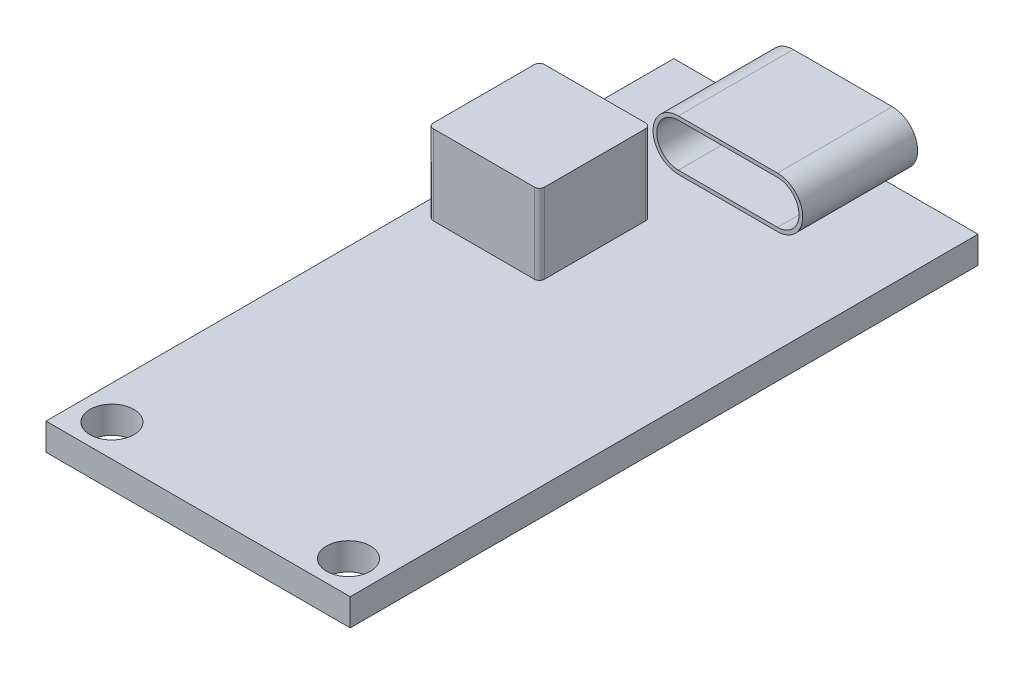
ISO-10303-21;
HEADER;
FILE_DESCRIPTION(('STEP AP214'),'2;1');
FILE_NAME('part.step','',(''),(''),'','','');
FILE_SCHEMA(('AUTOMOTIVE_DESIGN { 1 0 10303 214 1 1 1 1 }'));
ENDSEC;
DATA;
#1=APPLICATION_CONTEXT('core data for automotive mechanical design processes');
#2=APPLICATION_PROTOCOL_DEFINITION('international standard','automotive_design',2000,#1);
#3=PRODUCT_CONTEXT('',#1,'mechanical');
#4=PRODUCT('Part','Part','',(#3));
#5=PRODUCT_RELATED_PRODUCT_CATEGORY('part','',(#4));
#6=PRODUCT_DEFINITION_FORMATION('','',#4);
#7=PRODUCT_DEFINITION_CONTEXT('part definition',#1,'design');
#8=PRODUCT_DEFINITION('design','',#6,#7);
#9=PRODUCT_DEFINITION_SHAPE('','',#8);
#10=(LENGTH_UNIT() NAMED_UNIT(*) SI_UNIT(.MILLI.,.METRE.));
#11=(NAMED_UNIT(*) PLANE_ANGLE_UNIT() SI_UNIT($,.RADIAN.));
#12=(NAMED_UNIT(*) SI_UNIT($,.STERADIAN.) SOLID_ANGLE_UNIT());
#13=UNCERTAINTY_MEASURE_WITH_UNIT(LENGTH_MEASURE(1.E-05),#10,'distance_accuracy_value','');
#14=(GEOMETRIC_REPRESENTATION_CONTEXT(3) GLOBAL_UNCERTAINTY_ASSIGNED_CONTEXT((#13)) GLOBAL_UNIT_ASSIGNED_CONTEXT((#10,
#11,#12)) REPRESENTATION_CONTEXT('',''));
#15=CARTESIAN_POINT('',(0.,0.,0.));
#16=DIRECTION('',(0.,0.,1.));
#17=DIRECTION('',(1.,0.,0.));
#18=AXIS2_PLACEMENT_3D('',#15,#16,#17);
#19=CARTESIAN_POINT('',(0.,1.6,0.));
#20=DIRECTION('',(0.,1.,0.));
#21=DIRECTION('',(0.,0.,1.));
#22=AXIS2_PLACEMENT_3D('',#19,#20,#21);
#23=PLANE('',#22);
#24=CARTESIAN_POINT('',(-7.,1.6,16.675));
#25=DIRECTION('',(0.,1.,0.));
#26=DIRECTION('',(0.,0.,1.));
#27=AXIS2_PLACEMENT_3D('',#24,#25,#26);
#28=CIRCLE('',#27,1.3);
#29=CARTESIAN_POINT('',(-7.,1.6,17.975));
#30=VERTEX_POINT('',#29);
#31=EDGE_CURVE('E274',#30,#30,#28,.T.);
#32=ORIENTED_EDGE('',*,*,#31,.F.);
#33=EDGE_LOOP('',(#32));
#34=FACE_BOUND('',#33,.T.);
#35=CARTESIAN_POINT('',(7.,1.6,16.675));
#36=DIRECTION('',(0.,1.,0.));
#37=DIRECTION('',(0.,0.,1.));
#38=AXIS2_PLACEMENT_3D('',#35,#36,#37);
#39=CIRCLE('',#38,1.3);
#40=CARTESIAN_POINT('',(7.,1.6,17.975));
#41=VERTEX_POINT('',#40);
#42=EDGE_CURVE('E277',#41,#41,#39,.T.);
#43=ORIENTED_EDGE('',*,*,#42,.F.);
#44=EDGE_LOOP('',(#43));
#45=FACE_BOUND('',#44,.T.);
#46=DIRECTION('',(-1.,0.,0.));
#47=VECTOR('',#46,1.);
#48=CARTESIAN_POINT('',(-2.93,1.6,-12.775));
#49=LINE('',#48,#47);
#50=CARTESIAN_POINT('',(2.93,1.6,-12.775));
#51=VERTEX_POINT('',#50);
#52=CARTESIAN_POINT('',(-2.93,1.6,-12.775));
#53=VERTEX_POINT('',#52);
#54=EDGE_CURVE('E254',#51,#53,#49,.T.);
#55=ORIENTED_EDGE('',*,*,#54,.T.);
#56=DIRECTION('',(0.,0.,-1.));
#57=VECTOR('',#56,1.);
#58=CARTESIAN_POINT('',(-2.93,1.6,-12.775));
#59=LINE('',#58,#57);
#60=CARTESIAN_POINT('',(-2.93,1.6,-18.575));
#61=VERTEX_POINT('',#60);
#62=EDGE_CURVE('E258',#53,#61,#59,.T.);
#63=ORIENTED_EDGE('',*,*,#62,.T.);
#64=DIRECTION('',(-1.,0.,0.));
#65=VECTOR('',#64,1.);
#66=CARTESIAN_POINT('',(9.,1.6,-18.575));
#67=LINE('',#66,#65);
#68=CARTESIAN_POINT('',(-9.,1.6,-18.575));
#69=VERTEX_POINT('',#68);
#70=EDGE_CURVE('E290',#61,#69,#67,.T.);
#71=ORIENTED_EDGE('',*,*,#70,.T.);
#72=DIRECTION('',(0.,0.,1.));
#73=VECTOR('',#72,1.);
#74=CARTESIAN_POINT('',(-9.,1.6,18.575));
#75=LINE('',#74,#73);
#76=CARTESIAN_POINT('',(-9.,1.6,18.575));
#77=VERTEX_POINT('',#76);
#78=EDGE_CURVE('E282',#69,#77,#75,.T.);
#79=ORIENTED_EDGE('',*,*,#78,.T.);
#80=DIRECTION('',(1.,0.,0.));
#81=VECTOR('',#80,1.);
#82=CARTESIAN_POINT('',(9.,1.6,18.575));
#83=LINE('',#82,#81);
#84=CARTESIAN_POINT('',(9.,1.6,18.575));
#85=VERTEX_POINT('',#84);
#86=EDGE_CURVE('E285',#77,#85,#83,.T.);
#87=ORIENTED_EDGE('',*,*,#86,.T.);
#88=DIRECTION('',(0.,0.,-1.));
#89=VECTOR('',#88,1.);
#90=CARTESIAN_POINT('',(9.,1.6,18.575));
#91=LINE('',#90,#89);
#92=CARTESIAN_POINT('',(9.,1.6,-18.575));
#93=VERTEX_POINT('',#92);
#94=EDGE_CURVE('E288',#85,#93,#91,.T.);
#95=ORIENTED_EDGE('',*,*,#94,.T.);
#96=CARTESIAN_POINT('',(2.93,1.6,-18.575));
#97=VERTEX_POINT('',#96);
#98=EDGE_CURVE('E291',#93,#97,#67,.T.);
#99=ORIENTED_EDGE('',*,*,#98,.T.);
#100=DIRECTION('',(0.,0.,-1.));
#101=VECTOR('',#100,1.);
#102=CARTESIAN_POINT('',(2.93,1.6,-12.775));
#103=LINE('',#102,#101);
#104=EDGE_CURVE('E263',#51,#97,#103,.T.);
#105=ORIENTED_EDGE('',*,*,#104,.F.);
#106=EDGE_LOOP('',(#55,#63,#71,#79,#87,#95,#99,#105));
#107=FACE_BOUND('',#106,.T.);
#108=DIRECTION('',(-1.,0.,0.));
#109=VECTOR('',#108,1.);
#110=CARTESIAN_POINT('',(-8.1,1.6,-9.72500000000001));
#111=LINE('',#110,#109);
#112=CARTESIAN_POINT('',(-1.82,1.6,-9.72500000000001));
#113=VERTEX_POINT('',#112);
#114=CARTESIAN_POINT('',(-7.8,1.6,-9.72500000000001));
#115=VERTEX_POINT('',#114);
#116=EDGE_CURVE('E354',#113,#115,#111,.T.);
#117=ORIENTED_EDGE('',*,*,#116,.F.);
#118=CARTESIAN_POINT('',(-1.82,1.6,-9.42500000000001));
#119=DIRECTION('',(0.,1.,0.));
#120=DIRECTION('',(0.,0.,1.));
#121=AXIS2_PLACEMENT_3D('',#118,#119,#120);
#122=CIRCLE('',#121,0.3);
#123=CARTESIAN_POINT('',(-1.52,1.6,-9.42500000000001));
#124=VERTEX_POINT('',#123);
#125=EDGE_CURVE('E343',#113,#124,#122,.F.);
#126=ORIENTED_EDGE('',*,*,#125,.T.);
#127=DIRECTION('',(0.,0.,-1.));
#128=VECTOR('',#127,1.);
#129=CARTESIAN_POINT('',(-1.52,1.6,-9.72500000000001));
#130=LINE('',#129,#128);
#131=CARTESIAN_POINT('',(-1.52,1.6,-3.44500000000001));
#132=VERTEX_POINT('',#131);
#133=EDGE_CURVE('E373',#132,#124,#130,.T.);
#134=ORIENTED_EDGE('',*,*,#133,.F.);
#135=CARTESIAN_POINT('',(-1.82,1.6,-3.44500000000001));
#136=DIRECTION('',(0.,1.,0.));
#137=DIRECTION('',(0.,0.,1.));
#138=AXIS2_PLACEMENT_3D('',#135,#136,#137);
#139=CIRCLE('',#138,0.3);
#140=CARTESIAN_POINT('',(-1.82,1.6,-3.14500000000001));
#141=VERTEX_POINT('',#140);
#142=EDGE_CURVE('E11',#132,#141,#139,.F.);
#143=ORIENTED_EDGE('',*,*,#142,.T.);
#144=DIRECTION('',(1.,0.,0.));
#145=VECTOR('',#144,1.);
#146=CARTESIAN_POINT('',(-8.1,1.6,-3.14500000000001));
#147=LINE('',#146,#145);
#148=CARTESIAN_POINT('',(-7.8,1.6,-3.14500000000001));
#149=VERTEX_POINT('',#148);
#150=EDGE_CURVE('E348',#149,#141,#147,.T.);
#151=ORIENTED_EDGE('',*,*,#150,.F.);
#152=CARTESIAN_POINT('',(-7.8,1.6,-3.44500000000001));
#153=DIRECTION('',(0.,1.,0.));
#154=DIRECTION('',(0.,0.,1.));
#155=AXIS2_PLACEMENT_3D('',#152,#153,#154);
#156=CIRCLE('',#155,0.3);
#157=CARTESIAN_POINT('',(-8.1,1.6,-3.44500000000001));
#158=VERTEX_POINT('',#157);
#159=EDGE_CURVE('E55',#149,#158,#156,.F.);
#160=ORIENTED_EDGE('',*,*,#159,.T.);
#161=DIRECTION('',(0.,0.,1.));
#162=VECTOR('',#161,1.);
#163=CARTESIAN_POINT('',(-8.1,1.6,-9.72500000000001));
#164=LINE('',#163,#162);
#165=CARTESIAN_POINT('',(-8.1,1.6,-9.42500000000001));
#166=VERTEX_POINT('',#165);
#167=EDGE_CURVE('E347',#166,#158,#164,.T.);
#168=ORIENTED_EDGE('',*,*,#167,.F.);
#169=CARTESIAN_POINT('',(-7.8,1.6,-9.42500000000001));
#170=DIRECTION('',(0.,1.,0.));
#171=DIRECTION('',(0.,0.,1.));
#172=AXIS2_PLACEMENT_3D('',#169,#170,#171);
#173=CIRCLE('',#172,0.3);
#174=EDGE_CURVE('E341',#166,#115,#173,.F.);
#175=ORIENTED_EDGE('',*,*,#174,.T.);
#176=EDGE_LOOP('',(#117,#126,#134,#143,#151,#160,#168,#175));
#177=FACE_BOUND('',#176,.T.);
#178=ADVANCED_FACE('F47',(#34,#45,#107,#177),#23,.T.);
#179=CARTESIAN_POINT('',(-9.,1.6,18.575));
#180=DIRECTION('',(1.,0.,0.));
#181=DIRECTION('',(0.,0.,-1.));
#182=AXIS2_PLACEMENT_3D('',#179,#180,#181);
#183=PLANE('',#182);
#184=DIRECTION('',(0.,0.,1.));
#185=VECTOR('',#184,1.);
#186=CARTESIAN_POINT('',(-9.,0.,18.575));
#187=LINE('',#186,#185);
#188=CARTESIAN_POINT('',(-9.,0.,-18.575));
#189=VERTEX_POINT('',#188);
#190=CARTESIAN_POINT('',(-9.,0.,18.575));
#191=VERTEX_POINT('',#190);
#192=EDGE_CURVE('E273',#189,#191,#187,.T.);
#193=ORIENTED_EDGE('',*,*,#192,.T.);
#194=DIRECTION('',(0.,-1.,0.));
#195=VECTOR('',#194,1.);
#196=CARTESIAN_POINT('',(-9.,1.6,18.575));
#197=LINE('',#196,#195);
#198=EDGE_CURVE('E311',#77,#191,#197,.T.);
#199=ORIENTED_EDGE('',*,*,#198,.F.);
#200=ORIENTED_EDGE('',*,*,#78,.F.);
#201=DIRECTION('',(0.,-1.,0.));
#202=VECTOR('',#201,1.);
#203=CARTESIAN_POINT('',(-9.,1.6,-18.575));
#204=LINE('',#203,#202);
#205=EDGE_CURVE('E294',#69,#189,#204,.T.);
#206=ORIENTED_EDGE('',*,*,#205,.T.);
#207=EDGE_LOOP('',(#193,#199,#200,#206));
#208=FACE_BOUND('',#207,.T.);
#209=ADVANCED_FACE('F402',(#208),#183,.F.);
#210=CARTESIAN_POINT('',(9.,1.6,18.575));
#211=DIRECTION('',(0.,0.,-1.));
#212=DIRECTION('',(-1.,0.,0.));
#213=AXIS2_PLACEMENT_3D('',#210,#211,#212);
#214=PLANE('',#213);
#215=DIRECTION('',(1.,0.,0.));
#216=VECTOR('',#215,1.);
#217=CARTESIAN_POINT('',(9.,0.,18.575));
#218=LINE('',#217,#216);
#219=CARTESIAN_POINT('',(9.,0.,18.575));
#220=VERTEX_POINT('',#219);
#221=EDGE_CURVE('E298',#191,#220,#218,.T.);
#222=ORIENTED_EDGE('',*,*,#221,.T.);
#223=DIRECTION('',(0.,-1.,0.));
#224=VECTOR('',#223,1.);
#225=CARTESIAN_POINT('',(9.,1.6,18.575));
#226=LINE('',#225,#224);
#227=EDGE_CURVE('E308',#85,#220,#226,.T.);
#228=ORIENTED_EDGE('',*,*,#227,.F.);
#229=ORIENTED_EDGE('',*,*,#86,.F.);
#230=ORIENTED_EDGE('',*,*,#198,.T.);
#231=EDGE_LOOP('',(#222,#228,#229,#230));
#232=FACE_BOUND('',#231,.T.);
#233=ADVANCED_FACE('F408',(#232),#214,.F.);
#234=CARTESIAN_POINT('',(9.,1.6,18.575));
#235=DIRECTION('',(-1.,0.,0.));
#236=DIRECTION('',(0.,0.,1.));
#237=AXIS2_PLACEMENT_3D('',#234,#235,#236);
#238=PLANE('',#237);
#239=DIRECTION('',(0.,0.,-1.));
#240=VECTOR('',#239,1.);
#241=CARTESIAN_POINT('',(9.,0.,18.575));
#242=LINE('',#241,#240);
#243=CARTESIAN_POINT('',(9.,0.,-18.575));
#244=VERTEX_POINT('',#243);
#245=EDGE_CURVE('E300',#220,#244,#242,.T.);
#246=ORIENTED_EDGE('',*,*,#245,.T.);
#247=DIRECTION('',(0.,-1.,0.));
#248=VECTOR('',#247,1.);
#249=CARTESIAN_POINT('',(9.,1.6,-18.575));
#250=LINE('',#249,#248);
#251=EDGE_CURVE('E305',#93,#244,#250,.T.);
#252=ORIENTED_EDGE('',*,*,#251,.F.);
#253=ORIENTED_EDGE('',*,*,#94,.F.);
#254=ORIENTED_EDGE('',*,*,#227,.T.);
#255=EDGE_LOOP('',(#246,#252,#253,#254));
#256=FACE_BOUND('',#255,.T.);
#257=ADVANCED_FACE('F424',(#256),#238,.F.);
#258=CARTESIAN_POINT('',(9.,1.6,-18.575));
#259=DIRECTION('',(0.,0.,1.));
#260=DIRECTION('',(1.,0.,0.));
#261=AXIS2_PLACEMENT_3D('',#258,#259,#260);
#262=PLANE('',#261);
#263=DIRECTION('',(-1.,0.,0.));
#264=VECTOR('',#263,1.);
#265=CARTESIAN_POINT('',(9.,0.,-18.575));
#266=LINE('',#265,#264);
#267=EDGE_CURVE('E286',#244,#189,#266,.T.);
#268=ORIENTED_EDGE('',*,*,#267,.T.);
#269=ORIENTED_EDGE('',*,*,#205,.F.);
#270=ORIENTED_EDGE('',*,*,#70,.F.);
#271=EDGE_CURVE('E295',#97,#61,#67,.T.);
#272=ORIENTED_EDGE('',*,*,#271,.F.);
#273=ORIENTED_EDGE('',*,*,#98,.F.);
#274=ORIENTED_EDGE('',*,*,#251,.T.);
#275=EDGE_LOOP('',(#268,#269,#270,#272,#273,#274));
#276=FACE_BOUND('',#275,.T.);
#277=ADVANCED_FACE('F420',(#276),#262,.F.);
#278=CARTESIAN_POINT('',(0.,0.,0.));
#279=DIRECTION('',(0.,1.,0.));
#280=DIRECTION('',(0.,0.,1.));
#281=AXIS2_PLACEMENT_3D('',#278,#279,#280);
#282=PLANE('',#281);
#283=CARTESIAN_POINT('',(-7.,0.,16.675));
#284=DIRECTION('',(0.,1.,0.));
#285=DIRECTION('',(0.,0.,1.));
#286=AXIS2_PLACEMENT_3D('',#283,#284,#285);
#287=CIRCLE('',#286,1.3);
#288=CARTESIAN_POINT('',(-7.,0.,17.975));
#289=VERTEX_POINT('',#288);
#290=EDGE_CURVE('E270',#289,#289,#287,.T.);
#291=ORIENTED_EDGE('',*,*,#290,.T.);
#292=EDGE_LOOP('',(#291));
#293=FACE_BOUND('',#292,.T.);
#294=CARTESIAN_POINT('',(7.,0.,16.675));
#295=DIRECTION('',(0.,1.,0.));
#296=DIRECTION('',(0.,0.,1.));
#297=AXIS2_PLACEMENT_3D('',#294,#295,#296);
#298=CIRCLE('',#297,1.3);
#299=CARTESIAN_POINT('',(7.,0.,17.975));
#300=VERTEX_POINT('',#299);
#301=EDGE_CURVE('E261',#300,#300,#298,.T.);
#302=ORIENTED_EDGE('',*,*,#301,.T.);
#303=EDGE_LOOP('',(#302));
#304=FACE_BOUND('',#303,.T.);
#305=ORIENTED_EDGE('',*,*,#192,.F.);
#306=ORIENTED_EDGE('',*,*,#267,.F.);
#307=ORIENTED_EDGE('',*,*,#245,.F.);
#308=ORIENTED_EDGE('',*,*,#221,.F.);
#309=EDGE_LOOP('',(#305,#306,#307,#308));
#310=FACE_BOUND('',#309,.T.);
#311=ADVANCED_FACE('F417',(#293,#304,#310),#282,.F.);
#312=CARTESIAN_POINT('',(7.,0.,16.675));
#313=DIRECTION('',(0.,1.,0.));
#314=DIRECTION('',(0.,0.,1.));
#315=AXIS2_PLACEMENT_3D('',#312,#313,#314);
#316=CYLINDRICAL_SURFACE('',#315,1.3);
#317=ORIENTED_EDGE('',*,*,#301,.F.);
#318=EDGE_LOOP('',(#317));
#319=FACE_BOUND('',#318,.T.);
#320=ORIENTED_EDGE('',*,*,#42,.T.);
#321=EDGE_LOOP('',(#320));
#322=FACE_BOUND('',#321,.T.);
#323=ADVANCED_FACE('F415',(#319,#322),#316,.F.);
#324=CARTESIAN_POINT('',(-7.,0.,16.675));
#325=DIRECTION('',(0.,1.,0.));
#326=DIRECTION('',(0.,0.,1.));
#327=AXIS2_PLACEMENT_3D('',#324,#325,#326);
#328=CYLINDRICAL_SURFACE('',#327,1.3);
#329=ORIENTED_EDGE('',*,*,#290,.F.);
#330=EDGE_LOOP('',(#329));
#331=FACE_BOUND('',#330,.T.);
#332=ORIENTED_EDGE('',*,*,#31,.T.);
#333=EDGE_LOOP('',(#332));
#334=FACE_BOUND('',#333,.T.);
#335=ADVANCED_FACE('F580',(#331,#334),#328,.F.);
#336=CARTESIAN_POINT('',(-2.93,1.6,-12.775));
#337=DIRECTION('',(0.,-1.,0.));
#338=DIRECTION('',(0.,0.,-1.));
#339=AXIS2_PLACEMENT_3D('',#336,#337,#338);
#340=PLANE('',#339);
#341=ORIENTED_EDGE('',*,*,#271,.T.);
#342=CARTESIAN_POINT('',(-2.93,1.6,-19.575));
#343=VERTEX_POINT('',#342);
#344=EDGE_CURVE('E262',#61,#343,#59,.T.);
#345=ORIENTED_EDGE('',*,*,#344,.T.);
#346=DIRECTION('',(-1.,0.,0.));
#347=VECTOR('',#346,1.);
#348=CARTESIAN_POINT('',(-2.93,1.6,-19.575));
#349=LINE('',#348,#347);
#350=CARTESIAN_POINT('',(2.93,1.6,-19.575));
#351=VERTEX_POINT('',#350);
#352=EDGE_CURVE('E231',#351,#343,#349,.T.);
#353=ORIENTED_EDGE('',*,*,#352,.F.);
#354=EDGE_CURVE('E266',#97,#351,#103,.T.);
#355=ORIENTED_EDGE('',*,*,#354,.F.);
#356=EDGE_LOOP('',(#341,#345,#353,#355));
#357=FACE_BOUND('',#356,.T.);
#358=ADVANCED_FACE('F571',(#357),#340,.T.);
#359=CARTESIAN_POINT('',(-2.93,3.1,-12.775));
#360=DIRECTION('',(0.,0.,-1.));
#361=DIRECTION('',(-1.,0.,0.));
#362=AXIS2_PLACEMENT_3D('',#359,#360,#361);
#363=CYLINDRICAL_SURFACE('',#362,1.5);
#364=DIRECTION('',(0.,0.,-1.));
#365=VECTOR('',#364,1.);
#366=CARTESIAN_POINT('',(-2.93,4.6,-12.775));
#367=LINE('',#366,#365);
#368=CARTESIAN_POINT('',(-2.93,4.6,-12.775));
#369=VERTEX_POINT('',#368);
#370=CARTESIAN_POINT('',(-2.93,4.6,-19.575));
#371=VERTEX_POINT('',#370);
#372=EDGE_CURVE('E257',#369,#371,#367,.T.);
#373=ORIENTED_EDGE('',*,*,#372,.T.);
#374=CARTESIAN_POINT('',(-2.93,3.1,-19.575));
#375=DIRECTION('',(0.,0.,-1.));
#376=DIRECTION('',(-1.,0.,0.));
#377=AXIS2_PLACEMENT_3D('',#374,#375,#376);
#378=CIRCLE('',#377,1.5);
#379=EDGE_CURVE('E222',#343,#371,#378,.T.);
#380=ORIENTED_EDGE('',*,*,#379,.F.);
#381=ORIENTED_EDGE('',*,*,#344,.F.);
#382=ORIENTED_EDGE('',*,*,#62,.F.);
#383=CARTESIAN_POINT('',(-2.93,3.1,-12.775));
#384=DIRECTION('',(0.,0.,-1.));
#385=DIRECTION('',(-1.,0.,0.));
#386=AXIS2_PLACEMENT_3D('',#383,#384,#385);
#387=CIRCLE('',#386,1.5);
#388=EDGE_CURVE('E243',#53,#369,#387,.T.);
#389=ORIENTED_EDGE('',*,*,#388,.T.);
#390=EDGE_LOOP('',(#373,#380,#381,#382,#389));
#391=FACE_BOUND('',#390,.T.);
#392=ADVANCED_FACE('F562',(#391),#363,.T.);
#393=CARTESIAN_POINT('',(2.93,3.1,-12.775));
#394=DIRECTION('',(0.,0.,-1.));
#395=DIRECTION('',(-1.,0.,0.));
#396=AXIS2_PLACEMENT_3D('',#393,#394,#395);
#397=CYLINDRICAL_SURFACE('',#396,1.5);
#398=ORIENTED_EDGE('',*,*,#104,.T.);
#399=ORIENTED_EDGE('',*,*,#354,.T.);
#400=CARTESIAN_POINT('',(2.93,3.1,-19.575));
#401=DIRECTION('',(0.,0.,-1.));
#402=DIRECTION('',(-1.,0.,0.));
#403=AXIS2_PLACEMENT_3D('',#400,#401,#402);
#404=CIRCLE('',#403,1.5);
#405=CARTESIAN_POINT('',(2.93,4.6,-19.575));
#406=VERTEX_POINT('',#405);
#407=EDGE_CURVE('E228',#406,#351,#404,.T.);
#408=ORIENTED_EDGE('',*,*,#407,.F.);
#409=DIRECTION('',(0.,0.,-1.));
#410=VECTOR('',#409,1.);
#411=CARTESIAN_POINT('',(2.93,4.6,-12.775));
#412=LINE('',#411,#410);
#413=CARTESIAN_POINT('',(2.93,4.6,-12.775));
#414=VERTEX_POINT('',#413);
#415=EDGE_CURVE('E267',#414,#406,#412,.T.);
#416=ORIENTED_EDGE('',*,*,#415,.F.);
#417=CARTESIAN_POINT('',(2.93,3.1,-12.775));
#418=DIRECTION('',(0.,0.,-1.));
#419=DIRECTION('',(-1.,0.,0.));
#420=AXIS2_PLACEMENT_3D('',#417,#418,#419);
#421=CIRCLE('',#420,1.5);
#422=EDGE_CURVE('E252',#414,#51,#421,.T.);
#423=ORIENTED_EDGE('',*,*,#422,.T.);
#424=EDGE_LOOP('',(#398,#399,#408,#416,#423));
#425=FACE_BOUND('',#424,.T.);
#426=ADVANCED_FACE('F553',(#425),#397,.T.);
#427=CARTESIAN_POINT('',(-2.93,4.6,-12.775));
#428=DIRECTION('',(0.,1.,0.));
#429=DIRECTION('',(0.,0.,1.));
#430=AXIS2_PLACEMENT_3D('',#427,#428,#429);
#431=PLANE('',#430);
#432=ORIENTED_EDGE('',*,*,#415,.T.);
#433=DIRECTION('',(1.,0.,0.));
#434=VECTOR('',#433,1.);
#435=CARTESIAN_POINT('',(-2.93,4.6,-19.575));
#436=LINE('',#435,#434);
#437=EDGE_CURVE('E225',#371,#406,#436,.T.);
#438=ORIENTED_EDGE('',*,*,#437,.F.);
#439=ORIENTED_EDGE('',*,*,#372,.F.);
#440=DIRECTION('',(1.,0.,0.));
#441=VECTOR('',#440,1.);
#442=CARTESIAN_POINT('',(-2.93,4.6,-12.775));
#443=LINE('',#442,#441);
#444=EDGE_CURVE('E249',#369,#414,#443,.T.);
#445=ORIENTED_EDGE('',*,*,#444,.T.);
#446=EDGE_LOOP('',(#432,#438,#439,#445));
#447=FACE_BOUND('',#446,.T.);
#448=ADVANCED_FACE('F544',(#447),#431,.T.);
#449=CARTESIAN_POINT('',(-2.93,3.1,-12.775));
#450=DIRECTION('',(0.,0.,-1.));
#451=DIRECTION('',(-1.,0.,0.));
#452=AXIS2_PLACEMENT_3D('',#449,#450,#451);
#453=PLANE('',#452);
#454=DIRECTION('',(-1.,0.,0.));
#455=VECTOR('',#454,1.);
#456=CARTESIAN_POINT('',(-2.93,1.82,-12.775));
#457=LINE('',#456,#455);
#458=CARTESIAN_POINT('',(2.93,1.82,-12.775));
#459=VERTEX_POINT('',#458);
#460=CARTESIAN_POINT('',(-2.93,1.82,-12.775));
#461=VERTEX_POINT('',#460);
#462=EDGE_CURVE('E202',#459,#461,#457,.T.);
#463=ORIENTED_EDGE('',*,*,#462,.T.);
#464=CARTESIAN_POINT('',(-2.93,3.1,-12.775));
#465=DIRECTION('',(0.,0.,-1.));
#466=DIRECTION('',(-1.,0.,0.));
#467=AXIS2_PLACEMENT_3D('',#464,#465,#466);
#468=CIRCLE('',#467,1.28);
#469=CARTESIAN_POINT('',(-2.93,4.38,-12.775));
#470=VERTEX_POINT('',#469);
#471=EDGE_CURVE('E234',#461,#470,#468,.T.);
#472=ORIENTED_EDGE('',*,*,#471,.T.);
#473=DIRECTION('',(1.,0.,0.));
#474=VECTOR('',#473,1.);
#475=CARTESIAN_POINT('',(-2.93,4.38,-12.775));
#476=LINE('',#475,#474);
#477=CARTESIAN_POINT('',(2.93,4.38,-12.775));
#478=VERTEX_POINT('',#477);
#479=EDGE_CURVE('E197',#470,#478,#476,.T.);
#480=ORIENTED_EDGE('',*,*,#479,.T.);
#481=CARTESIAN_POINT('',(2.93,3.1,-12.775));
#482=DIRECTION('',(0.,0.,-1.));
#483=DIRECTION('',(-1.,0.,0.));
#484=AXIS2_PLACEMENT_3D('',#481,#482,#483);
#485=CIRCLE('',#484,1.28);
#486=EDGE_CURVE('E237',#478,#459,#485,.T.);
#487=ORIENTED_EDGE('',*,*,#486,.T.);
#488=EDGE_LOOP('',(#463,#472,#480,#487));
#489=FACE_BOUND('',#488,.T.);
#490=ORIENTED_EDGE('',*,*,#388,.F.);
#491=ORIENTED_EDGE('',*,*,#54,.F.);
#492=ORIENTED_EDGE('',*,*,#422,.F.);
#493=ORIENTED_EDGE('',*,*,#444,.F.);
#494=EDGE_LOOP('',(#490,#491,#492,#493));
#495=FACE_BOUND('',#494,.T.);
#496=ADVANCED_FACE('F536',(#489,#495),#453,.F.);
#497=CARTESIAN_POINT('',(-2.93,3.1,-12.775));
#498=DIRECTION('',(0.,0.,-1.));
#499=DIRECTION('',(-1.,0.,0.));
#500=AXIS2_PLACEMENT_3D('',#497,#498,#499);
#501=CYLINDRICAL_SURFACE('',#500,1.28);
#502=DIRECTION('',(0.,0.,-1.));
#503=VECTOR('',#502,1.);
#504=CARTESIAN_POINT('',(-2.93,1.82,-12.775));
#505=LINE('',#504,#503);
#506=CARTESIAN_POINT('',(-2.93,1.82,-19.575));
#507=VERTEX_POINT('',#506);
#508=EDGE_CURVE('E207',#461,#507,#505,.T.);
#509=ORIENTED_EDGE('',*,*,#508,.T.);
#510=CARTESIAN_POINT('',(-2.93,3.1,-19.575));
#511=DIRECTION('',(0.,0.,-1.));
#512=DIRECTION('',(-1.,0.,0.));
#513=AXIS2_PLACEMENT_3D('',#510,#511,#512);
#514=CIRCLE('',#513,1.28);
#515=CARTESIAN_POINT('',(-2.93,4.38,-19.575));
#516=VERTEX_POINT('',#515);
#517=EDGE_CURVE('E205',#507,#516,#514,.T.);
#518=ORIENTED_EDGE('',*,*,#517,.T.);
#519=DIRECTION('',(0.,0.,-1.));
#520=VECTOR('',#519,1.);
#521=CARTESIAN_POINT('',(-2.93,4.38,-12.775));
#522=LINE('',#521,#520);
#523=EDGE_CURVE('E189',#470,#516,#522,.T.);
#524=ORIENTED_EDGE('',*,*,#523,.F.);
#525=ORIENTED_EDGE('',*,*,#471,.F.);
#526=EDGE_LOOP('',(#509,#518,#524,#525));
#527=FACE_BOUND('',#526,.T.);
#528=ADVANCED_FACE('F206',(#527),#501,.F.);
#529=CARTESIAN_POINT('',(-2.93,1.82,-12.775));
#530=DIRECTION('',(0.,-1.,0.));
#531=DIRECTION('',(0.,0.,-1.));
#532=AXIS2_PLACEMENT_3D('',#529,#530,#531);
#533=PLANE('',#532);
#534=DIRECTION('',(0.,0.,-1.));
#535=VECTOR('',#534,1.);
#536=CARTESIAN_POINT('',(2.93,1.82,-12.775));
#537=LINE('',#536,#535);
#538=CARTESIAN_POINT('',(2.93,1.82,-19.575));
#539=VERTEX_POINT('',#538);
#540=EDGE_CURVE('E244',#459,#539,#537,.T.);
#541=ORIENTED_EDGE('',*,*,#540,.T.);
#542=DIRECTION('',(-1.,0.,0.));
#543=VECTOR('',#542,1.);
#544=CARTESIAN_POINT('',(-2.93,1.82,-19.575));
#545=LINE('',#544,#543);
#546=EDGE_CURVE('E217',#539,#507,#545,.T.);
#547=ORIENTED_EDGE('',*,*,#546,.T.);
#548=ORIENTED_EDGE('',*,*,#508,.F.);
#549=ORIENTED_EDGE('',*,*,#462,.F.);
#550=EDGE_LOOP('',(#541,#547,#548,#549));
#551=FACE_BOUND('',#550,.T.);
#552=ADVANCED_FACE('F519',(#551),#533,.F.);
#553=CARTESIAN_POINT('',(2.93,3.1,-12.775));
#554=DIRECTION('',(0.,0.,-1.));
#555=DIRECTION('',(-1.,0.,0.));
#556=AXIS2_PLACEMENT_3D('',#553,#554,#555);
#557=CYLINDRICAL_SURFACE('',#556,1.28);
#558=DIRECTION('',(0.,0.,-1.));
#559=VECTOR('',#558,1.);
#560=CARTESIAN_POINT('',(2.93,4.38,-12.775));
#561=LINE('',#560,#559);
#562=CARTESIAN_POINT('',(2.93,4.38,-19.575));
#563=VERTEX_POINT('',#562);
#564=EDGE_CURVE('E201',#478,#563,#561,.T.);
#565=ORIENTED_EDGE('',*,*,#564,.T.);
#566=CARTESIAN_POINT('',(2.93,3.1,-19.575));
#567=DIRECTION('',(0.,0.,-1.));
#568=DIRECTION('',(-1.,0.,0.));
#569=AXIS2_PLACEMENT_3D('',#566,#567,#568);
#570=CIRCLE('',#569,1.28);
#571=EDGE_CURVE('E215',#563,#539,#570,.T.);
#572=ORIENTED_EDGE('',*,*,#571,.T.);
#573=ORIENTED_EDGE('',*,*,#540,.F.);
#574=ORIENTED_EDGE('',*,*,#486,.F.);
#575=EDGE_LOOP('',(#565,#572,#573,#574));
#576=FACE_BOUND('',#575,.T.);
#577=ADVANCED_FACE('F511',(#576),#557,.F.);
#578=CARTESIAN_POINT('',(-2.93,4.38,-12.775));
#579=DIRECTION('',(0.,1.,0.));
#580=DIRECTION('',(0.,0.,1.));
#581=AXIS2_PLACEMENT_3D('',#578,#579,#580);
#582=PLANE('',#581);
#583=ORIENTED_EDGE('',*,*,#523,.T.);
#584=DIRECTION('',(1.,0.,0.));
#585=VECTOR('',#584,1.);
#586=CARTESIAN_POINT('',(-2.93,4.38,-19.575));
#587=LINE('',#586,#585);
#588=EDGE_CURVE('E194',#516,#563,#587,.T.);
#589=ORIENTED_EDGE('',*,*,#588,.T.);
#590=ORIENTED_EDGE('',*,*,#564,.F.);
#591=ORIENTED_EDGE('',*,*,#479,.F.);
#592=EDGE_LOOP('',(#583,#589,#590,#591));
#593=FACE_BOUND('',#592,.T.);
#594=ADVANCED_FACE('F191',(#593),#582,.F.);
#595=CARTESIAN_POINT('',(-2.93,3.1,-19.575));
#596=DIRECTION('',(0.,0.,-1.));
#597=DIRECTION('',(-1.,0.,0.));
#598=AXIS2_PLACEMENT_3D('',#595,#596,#597);
#599=PLANE('',#598);
#600=ORIENTED_EDGE('',*,*,#379,.T.);
#601=ORIENTED_EDGE('',*,*,#437,.T.);
#602=ORIENTED_EDGE('',*,*,#407,.T.);
#603=ORIENTED_EDGE('',*,*,#352,.T.);
#604=EDGE_LOOP('',(#600,#601,#602,#603));
#605=FACE_BOUND('',#604,.T.);
#606=ORIENTED_EDGE('',*,*,#588,.F.);
#607=ORIENTED_EDGE('',*,*,#517,.F.);
#608=ORIENTED_EDGE('',*,*,#546,.F.);
#609=ORIENTED_EDGE('',*,*,#571,.F.);
#610=EDGE_LOOP('',(#606,#607,#608,#609));
#611=FACE_BOUND('',#610,.T.);
#612=ADVANCED_FACE('F213',(#605,#611),#599,.T.);
#613=CARTESIAN_POINT('',(-1.52,6.32,-9.72500000000001));
#614=DIRECTION('',(-1.,0.,0.));
#615=DIRECTION('',(0.,0.,1.));
#616=AXIS2_PLACEMENT_3D('',#613,#614,#615);
#617=PLANE('',#616);
#618=ORIENTED_EDGE('',*,*,#133,.T.);
#619=DIRECTION('',(0.,-1.,0.));
#620=VECTOR('',#619,1.);
#621=CARTESIAN_POINT('',(-1.52,6.32,-9.42500000000001));
#622=LINE('',#621,#620);
#623=CARTESIAN_POINT('',(-1.52,6.32,-9.42500000000001));
#624=VERTEX_POINT('',#623);
#625=EDGE_CURVE('E335',#124,#624,#622,.F.);
#626=ORIENTED_EDGE('',*,*,#625,.T.);
#627=DIRECTION('',(0.,0.,-1.));
#628=VECTOR('',#627,1.);
#629=CARTESIAN_POINT('',(-1.52,6.32,-9.72500000000001));
#630=LINE('',#629,#628);
#631=CARTESIAN_POINT('',(-1.52,6.32,-3.44500000000001));
#632=VERTEX_POINT('',#631);
#633=EDGE_CURVE('E377',#632,#624,#630,.T.);
#634=ORIENTED_EDGE('',*,*,#633,.F.);
#635=DIRECTION('',(0.,-1.,0.));
#636=VECTOR('',#635,1.);
#637=CARTESIAN_POINT('',(-1.52,6.32,-3.44500000000001));
#638=LINE('',#637,#636);
#639=EDGE_CURVE('E332',#632,#132,#638,.T.);
#640=ORIENTED_EDGE('',*,*,#639,.T.);
#641=EDGE_LOOP('',(#618,#626,#634,#640));
#642=FACE_BOUND('',#641,.T.);
#643=ADVANCED_FACE('F394',(#642),#617,.F.);
#644=CARTESIAN_POINT('',(-8.1,6.32,-9.72500000000001));
#645=DIRECTION('',(0.,0.,1.));
#646=DIRECTION('',(1.,0.,0.));
#647=AXIS2_PLACEMENT_3D('',#644,#645,#646);
#648=PLANE('',#647);
#649=ORIENTED_EDGE('',*,*,#116,.T.);
#650=DIRECTION('',(0.,-1.,0.));
#651=VECTOR('',#650,1.);
#652=CARTESIAN_POINT('',(-7.8,6.32,-9.72500000000001));
#653=LINE('',#652,#651);
#654=CARTESIAN_POINT('',(-7.8,6.32,-9.72500000000001));
#655=VERTEX_POINT('',#654);
#656=EDGE_CURVE('E322',#115,#655,#653,.F.);
#657=ORIENTED_EDGE('',*,*,#656,.T.);
#658=DIRECTION('',(-1.,0.,0.));
#659=VECTOR('',#658,1.);
#660=CARTESIAN_POINT('',(-8.1,6.32,-9.72500000000001));
#661=LINE('',#660,#659);
#662=CARTESIAN_POINT('',(-1.82,6.32,-9.72500000000001));
#663=VERTEX_POINT('',#662);
#664=EDGE_CURVE('E369',#663,#655,#661,.T.);
#665=ORIENTED_EDGE('',*,*,#664,.F.);
#666=DIRECTION('',(0.,-1.,0.));
#667=VECTOR('',#666,1.);
#668=CARTESIAN_POINT('',(-1.82,6.32,-9.72500000000001));
#669=LINE('',#668,#667);
#670=EDGE_CURVE('E319',#663,#113,#669,.T.);
#671=ORIENTED_EDGE('',*,*,#670,.T.);
#672=EDGE_LOOP('',(#649,#657,#665,#671));
#673=FACE_BOUND('',#672,.T.);
#674=ADVANCED_FACE('F389',(#673),#648,.F.);
#675=CARTESIAN_POINT('',(-8.1,6.32,-9.72500000000001));
#676=DIRECTION('',(1.,0.,0.));
#677=DIRECTION('',(0.,0.,-1.));
#678=AXIS2_PLACEMENT_3D('',#675,#676,#677);
#679=PLANE('',#678);
#680=DIRECTION('',(0.,0.,1.));
#681=VECTOR('',#680,1.);
#682=CARTESIAN_POINT('',(-8.1,6.32,-9.72500000000001));
#683=LINE('',#682,#681);
#684=CARTESIAN_POINT('',(-8.1,6.32,-9.42500000000001));
#685=VERTEX_POINT('',#684);
#686=CARTESIAN_POINT('',(-8.1,6.32,-3.44500000000001));
#687=VERTEX_POINT('',#686);
#688=EDGE_CURVE('E364',#685,#687,#683,.T.);
#689=ORIENTED_EDGE('',*,*,#688,.F.);
#690=DIRECTION('',(0.,-1.,0.));
#691=VECTOR('',#690,1.);
#692=CARTESIAN_POINT('',(-8.1,6.32,-9.42500000000001));
#693=LINE('',#692,#691);
#694=EDGE_CURVE('E316',#685,#166,#693,.T.);
#695=ORIENTED_EDGE('',*,*,#694,.T.);
#696=ORIENTED_EDGE('',*,*,#167,.T.);
#697=DIRECTION('',(0.,-1.,0.));
#698=VECTOR('',#697,1.);
#699=CARTESIAN_POINT('',(-8.1,6.32,-3.44500000000001));
#700=LINE('',#699,#698);
#701=EDGE_CURVE('E314',#158,#687,#700,.F.);
#702=ORIENTED_EDGE('',*,*,#701,.T.);
#703=EDGE_LOOP('',(#689,#695,#696,#702));
#704=FACE_BOUND('',#703,.T.);
#705=ADVANCED_FACE('F351',(#704),#679,.F.);
#706=CARTESIAN_POINT('',(-8.1,6.32,-3.14500000000001));
#707=DIRECTION('',(0.,0.,-1.));
#708=DIRECTION('',(-1.,0.,0.));
#709=AXIS2_PLACEMENT_3D('',#706,#707,#708);
#710=PLANE('',#709);
#711=DIRECTION('',(1.,0.,0.));
#712=VECTOR('',#711,1.);
#713=CARTESIAN_POINT('',(-8.1,6.32,-3.14500000000001));
#714=LINE('',#713,#712);
#715=CARTESIAN_POINT('',(-7.8,6.32,-3.14500000000001));
#716=VERTEX_POINT('',#715);
#717=CARTESIAN_POINT('',(-1.82,6.32,-3.14500000000001));
#718=VERTEX_POINT('',#717);
#719=EDGE_CURVE('E211',#716,#718,#714,.T.);
#720=ORIENTED_EDGE('',*,*,#719,.F.);
#721=DIRECTION('',(0.,-1.,0.));
#722=VECTOR('',#721,1.);
#723=CARTESIAN_POINT('',(-7.8,6.32,-3.14500000000001));
#724=LINE('',#723,#722);
#725=EDGE_CURVE('E339',#716,#149,#724,.T.);
#726=ORIENTED_EDGE('',*,*,#725,.T.);
#727=ORIENTED_EDGE('',*,*,#150,.T.);
#728=DIRECTION('',(0.,-1.,0.));
#729=VECTOR('',#728,1.);
#730=CARTESIAN_POINT('',(-1.82,6.32,-3.14500000000001));
#731=LINE('',#730,#729);
#732=EDGE_CURVE('E337',#141,#718,#731,.F.);
#733=ORIENTED_EDGE('',*,*,#732,.T.);
#734=EDGE_LOOP('',(#720,#726,#727,#733));
#735=FACE_BOUND('',#734,.T.);
#736=ADVANCED_FACE('F366',(#735),#710,.F.);
#737=CARTESIAN_POINT('',(0.,6.32,0.));
#738=DIRECTION('',(0.,1.,0.));
#739=DIRECTION('',(0.,0.,1.));
#740=AXIS2_PLACEMENT_3D('',#737,#738,#739);
#741=PLANE('',#740);
#742=ORIENTED_EDGE('',*,*,#664,.T.);
#743=CARTESIAN_POINT('',(-7.8,6.32,-9.42500000000001));
#744=DIRECTION('',(0.,1.,0.));
#745=DIRECTION('',(0.,0.,1.));
#746=AXIS2_PLACEMENT_3D('',#743,#744,#745);
#747=CIRCLE('',#746,0.3);
#748=EDGE_CURVE('E330',#655,#685,#747,.T.);
#749=ORIENTED_EDGE('',*,*,#748,.T.);
#750=ORIENTED_EDGE('',*,*,#688,.T.);
#751=CARTESIAN_POINT('',(-7.8,6.32,-3.44500000000001));
#752=DIRECTION('',(0.,1.,0.));
#753=DIRECTION('',(0.,0.,1.));
#754=AXIS2_PLACEMENT_3D('',#751,#752,#753);
#755=CIRCLE('',#754,0.3);
#756=EDGE_CURVE('E326',#687,#716,#755,.T.);
#757=ORIENTED_EDGE('',*,*,#756,.T.);
#758=ORIENTED_EDGE('',*,*,#719,.T.);
#759=CARTESIAN_POINT('',(-1.82,6.32,-3.44500000000001));
#760=DIRECTION('',(0.,1.,0.));
#761=DIRECTION('',(0.,0.,1.));
#762=AXIS2_PLACEMENT_3D('',#759,#760,#761);
#763=CIRCLE('',#762,0.3);
#764=EDGE_CURVE('E324',#718,#632,#763,.T.);
#765=ORIENTED_EDGE('',*,*,#764,.T.);
#766=ORIENTED_EDGE('',*,*,#633,.T.);
#767=CARTESIAN_POINT('',(-1.82,6.32,-9.42500000000001));
#768=DIRECTION('',(0.,1.,0.));
#769=DIRECTION('',(0.,0.,1.));
#770=AXIS2_PLACEMENT_3D('',#767,#768,#769);
#771=CIRCLE('',#770,0.3);
#772=EDGE_CURVE('E328',#624,#663,#771,.T.);
#773=ORIENTED_EDGE('',*,*,#772,.T.);
#774=EDGE_LOOP('',(#742,#749,#750,#757,#758,#765,#766,#773));
#775=FACE_BOUND('',#774,.T.);
#776=ADVANCED_FACE('F362',(#775),#741,.T.);
#777=CARTESIAN_POINT('',(-7.8,6.32,-9.42500000000001));
#778=DIRECTION('',(0.,-1.,0.));
#779=DIRECTION('',(0.,0.,-1.));
#780=AXIS2_PLACEMENT_3D('',#777,#778,#779);
#781=CYLINDRICAL_SURFACE('',#780,0.3);
#782=ORIENTED_EDGE('',*,*,#748,.F.);
#783=ORIENTED_EDGE('',*,*,#656,.F.);
#784=ORIENTED_EDGE('',*,*,#174,.F.);
#785=ORIENTED_EDGE('',*,*,#694,.F.);
#786=EDGE_LOOP('',(#782,#783,#784,#785));
#787=FACE_BOUND('',#786,.T.);
#788=ADVANCED_FACE('F388',(#787),#781,.T.);
#789=CARTESIAN_POINT('',(-1.82,6.32,-9.42500000000001));
#790=DIRECTION('',(0.,-1.,0.));
#791=DIRECTION('',(0.,0.,-1.));
#792=AXIS2_PLACEMENT_3D('',#789,#790,#791);
#793=CYLINDRICAL_SURFACE('',#792,0.3);
#794=ORIENTED_EDGE('',*,*,#772,.F.);
#795=ORIENTED_EDGE('',*,*,#625,.F.);
#796=ORIENTED_EDGE('',*,*,#125,.F.);
#797=ORIENTED_EDGE('',*,*,#670,.F.);
#798=EDGE_LOOP('',(#794,#795,#796,#797));
#799=FACE_BOUND('',#798,.T.);
#800=ADVANCED_FACE('F391',(#799),#793,.T.);
#801=CARTESIAN_POINT('',(-7.8,6.32,-3.44500000000001));
#802=DIRECTION('',(0.,-1.,0.));
#803=DIRECTION('',(0.,0.,-1.));
#804=AXIS2_PLACEMENT_3D('',#801,#802,#803);
#805=CYLINDRICAL_SURFACE('',#804,0.3);
#806=ORIENTED_EDGE('',*,*,#756,.F.);
#807=ORIENTED_EDGE('',*,*,#701,.F.);
#808=ORIENTED_EDGE('',*,*,#159,.F.);
#809=ORIENTED_EDGE('',*,*,#725,.F.);
#810=EDGE_LOOP('',(#806,#807,#808,#809));
#811=FACE_BOUND('',#810,.T.);
#812=ADVANCED_FACE('F357',(#811),#805,.T.);
#813=CARTESIAN_POINT('',(-1.82,6.32,-3.44500000000001));
#814=DIRECTION('',(0.,-1.,0.));
#815=DIRECTION('',(0.,0.,-1.));
#816=AXIS2_PLACEMENT_3D('',#813,#814,#815);
#817=CYLINDRICAL_SURFACE('',#816,0.3);
#818=ORIENTED_EDGE('',*,*,#764,.F.);
#819=ORIENTED_EDGE('',*,*,#732,.F.);
#820=ORIENTED_EDGE('',*,*,#142,.F.);
#821=ORIENTED_EDGE('',*,*,#639,.F.);
#822=EDGE_LOOP('',(#818,#819,#820,#821));
#823=FACE_BOUND('',#822,.T.);
#824=ADVANCED_FACE('F49',(#823),#817,.T.);
#825=CLOSED_SHELL('',(#178,#209,#233,#257,#277,#311,#323,#335,#358,#392,#426,#448,#496,#528,
#552,#577,#594,#612,#643,#674,#705,#736,#776,#788,#800,#812,#824));
#826=MANIFOLD_SOLID_BREP('B2',#825);
#827=ADVANCED_BREP_SHAPE_REPRESENTATION('',(#18,#826),#14);
#828=SHAPE_DEFINITION_REPRESENTATION(#9,#827);
ENDSEC;
END-ISO-10303-21;
